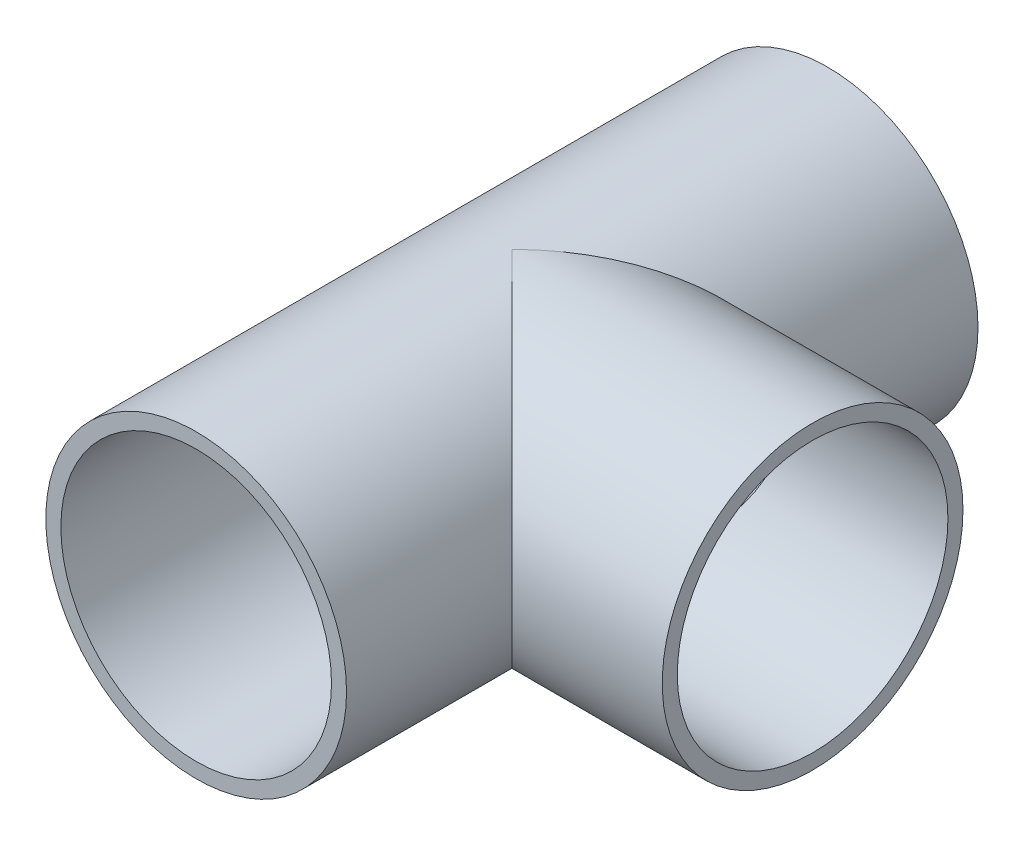
ISO-10303-21;
HEADER;
FILE_DESCRIPTION(('STEP AP214'),'2;1');
FILE_NAME('part.step','',(''),(''),'','','');
FILE_SCHEMA(('AUTOMOTIVE_DESIGN { 1 0 10303 214 1 1 1 1 }'));
ENDSEC;
DATA;
#1=APPLICATION_CONTEXT('core data for automotive mechanical design processes');
#2=APPLICATION_PROTOCOL_DEFINITION('international standard','automotive_design',2000,#1);
#3=PRODUCT_CONTEXT('',#1,'mechanical');
#4=PRODUCT('Part','Part','',(#3));
#5=PRODUCT_RELATED_PRODUCT_CATEGORY('part','',(#4));
#6=PRODUCT_DEFINITION_FORMATION('','',#4);
#7=PRODUCT_DEFINITION_CONTEXT('part definition',#1,'design');
#8=PRODUCT_DEFINITION('design','',#6,#7);
#9=PRODUCT_DEFINITION_SHAPE('','',#8);
#10=(LENGTH_UNIT() NAMED_UNIT(*) SI_UNIT(.MILLI.,.METRE.));
#11=(NAMED_UNIT(*) PLANE_ANGLE_UNIT() SI_UNIT($,.RADIAN.));
#12=(NAMED_UNIT(*) SI_UNIT($,.STERADIAN.) SOLID_ANGLE_UNIT());
#13=UNCERTAINTY_MEASURE_WITH_UNIT(LENGTH_MEASURE(1.E-05),#10,'distance_accuracy_value','');
#14=(GEOMETRIC_REPRESENTATION_CONTEXT(3) GLOBAL_UNCERTAINTY_ASSIGNED_CONTEXT((#13)) GLOBAL_UNIT_ASSIGNED_CONTEXT((#10,
#11,#12)) REPRESENTATION_CONTEXT('',''));
#15=CARTESIAN_POINT('',(0.,0.,0.));
#16=DIRECTION('',(0.,0.,1.));
#17=DIRECTION('',(1.,0.,0.));
#18=AXIS2_PLACEMENT_3D('',#15,#16,#17);
#19=CARTESIAN_POINT('',(0.,0.,53.34));
#20=DIRECTION('',(0.,0.,-1.));
#21=DIRECTION('',(-1.,0.,0.));
#22=AXIS2_PLACEMENT_3D('',#19,#20,#21);
#23=CYLINDRICAL_SURFACE('',#22,11.43);
#24=CARTESIAN_POINT('',(0.,0.,26.67));
#25=DIRECTION('',(0.707106781186547,0.,-0.707106781186547));
#26=DIRECTION('',(0.707106781186547,0.,0.707106781186547));
#27=AXIS2_PLACEMENT_3D('',#24,#25,#26);
#28=ELLIPSE('',#27,16.1644610179245,11.43);
#29=CARTESIAN_POINT('',(0.,-11.43,26.67));
#30=VERTEX_POINT('',#29);
#31=CARTESIAN_POINT('',(0.,11.43,26.67));
#32=VERTEX_POINT('',#31);
#33=EDGE_CURVE('E11',#30,#32,#28,.F.);
#34=ORIENTED_EDGE('',*,*,#33,.F.);
#35=CARTESIAN_POINT('',(0.,0.,26.67));
#36=DIRECTION('',(0.707106781186547,0.,0.707106781186547));
#37=DIRECTION('',(0.707106781186547,0.,-0.707106781186547));
#38=AXIS2_PLACEMENT_3D('',#35,#36,#37);
#39=ELLIPSE('',#38,16.1644610179245,11.43);
#40=EDGE_CURVE('E45',#32,#30,#39,.F.);
#41=ORIENTED_EDGE('',*,*,#40,.F.);
#42=EDGE_LOOP('',(#34,#41));
#43=FACE_BOUND('',#42,.T.);
#44=CARTESIAN_POINT('',(0.,0.,53.34));
#45=DIRECTION('',(0.,0.,1.));
#46=DIRECTION('',(1.,0.,0.));
#47=AXIS2_PLACEMENT_3D('',#44,#45,#46);
#48=CIRCLE('',#47,11.43);
#49=CARTESIAN_POINT('',(11.43,0.,53.34));
#50=VERTEX_POINT('',#49);
#51=EDGE_CURVE('E99',#50,#50,#48,.T.);
#52=ORIENTED_EDGE('',*,*,#51,.T.);
#53=EDGE_LOOP('',(#52));
#54=FACE_BOUND('',#53,.T.);
#55=CARTESIAN_POINT('',(0.,0.,0.));
#56=DIRECTION('',(0.,0.,1.));
#57=DIRECTION('',(1.,0.,0.));
#58=AXIS2_PLACEMENT_3D('',#55,#56,#57);
#59=CIRCLE('',#58,11.43);
#60=CARTESIAN_POINT('',(11.43,0.,0.));
#61=VERTEX_POINT('',#60);
#62=EDGE_CURVE('E97',#61,#61,#59,.T.);
#63=ORIENTED_EDGE('',*,*,#62,.F.);
#64=EDGE_LOOP('',(#63));
#65=FACE_BOUND('',#64,.T.);
#66=ADVANCED_FACE('F37',(#43,#54,#65),#23,.F.);
#67=CARTESIAN_POINT('',(0.,0.,53.34));
#68=DIRECTION('',(0.,0.,1.));
#69=DIRECTION('',(1.,0.,0.));
#70=AXIS2_PLACEMENT_3D('',#67,#68,#69);
#71=PLANE('',#70);
#72=CARTESIAN_POINT('',(0.,0.,53.34));
#73=DIRECTION('',(0.,0.,1.));
#74=DIRECTION('',(1.,0.,0.));
#75=AXIS2_PLACEMENT_3D('',#72,#73,#74);
#76=CIRCLE('',#75,12.7);
#77=CARTESIAN_POINT('',(12.7,0.,53.34));
#78=VERTEX_POINT('',#77);
#79=EDGE_CURVE('E63',#78,#78,#76,.T.);
#80=ORIENTED_EDGE('',*,*,#79,.T.);
#81=EDGE_LOOP('',(#80));
#82=FACE_BOUND('',#81,.T.);
#83=ORIENTED_EDGE('',*,*,#51,.F.);
#84=EDGE_LOOP('',(#83));
#85=FACE_BOUND('',#84,.T.);
#86=ADVANCED_FACE('F79',(#82,#85),#71,.T.);
#87=CARTESIAN_POINT('',(0.,0.,0.));
#88=DIRECTION('',(0.,0.,1.));
#89=DIRECTION('',(1.,0.,0.));
#90=AXIS2_PLACEMENT_3D('',#87,#88,#89);
#91=PLANE('',#90);
#92=CARTESIAN_POINT('',(0.,0.,0.));
#93=DIRECTION('',(0.,0.,1.));
#94=DIRECTION('',(1.,0.,0.));
#95=AXIS2_PLACEMENT_3D('',#92,#93,#94);
#96=CIRCLE('',#95,12.7);
#97=CARTESIAN_POINT('',(12.7,0.,0.));
#98=VERTEX_POINT('',#97);
#99=EDGE_CURVE('E94',#98,#98,#96,.T.);
#100=ORIENTED_EDGE('',*,*,#99,.F.);
#101=EDGE_LOOP('',(#100));
#102=FACE_BOUND('',#101,.T.);
#103=ORIENTED_EDGE('',*,*,#62,.T.);
#104=EDGE_LOOP('',(#103));
#105=FACE_BOUND('',#104,.T.);
#106=ADVANCED_FACE('F83',(#102,#105),#91,.F.);
#107=CARTESIAN_POINT('',(0.,0.,53.34));
#108=DIRECTION('',(0.,0.,-1.));
#109=DIRECTION('',(-1.,0.,0.));
#110=AXIS2_PLACEMENT_3D('',#107,#108,#109);
#111=CYLINDRICAL_SURFACE('',#110,12.7);
#112=CARTESIAN_POINT('',(0.,0.,26.67));
#113=DIRECTION('',(0.707106781186547,0.,-0.707106781186547));
#114=DIRECTION('',(-0.707106781186547,0.,-0.707106781186547));
#115=AXIS2_PLACEMENT_3D('',#112,#113,#114);
#116=ELLIPSE('',#115,17.9605122421383,12.7);
#117=CARTESIAN_POINT('',(0.,-12.7,26.67));
#118=VERTEX_POINT('',#117);
#119=CARTESIAN_POINT('',(0.,12.7,26.67));
#120=VERTEX_POINT('',#119);
#121=EDGE_CURVE('E100',#118,#120,#116,.F.);
#122=ORIENTED_EDGE('',*,*,#121,.T.);
#123=CARTESIAN_POINT('',(0.,0.,26.67));
#124=DIRECTION('',(-0.707106781186547,0.,-0.707106781186547));
#125=DIRECTION('',(0.707106781186547,0.,-0.707106781186547));
#126=AXIS2_PLACEMENT_3D('',#123,#124,#125);
#127=ELLIPSE('',#126,17.9605122421383,12.7);
#128=EDGE_CURVE('E56',#120,#118,#127,.T.);
#129=ORIENTED_EDGE('',*,*,#128,.T.);
#130=EDGE_LOOP('',(#122,#129));
#131=FACE_BOUND('',#130,.T.);
#132=ORIENTED_EDGE('',*,*,#79,.F.);
#133=EDGE_LOOP('',(#132));
#134=FACE_BOUND('',#133,.T.);
#135=ORIENTED_EDGE('',*,*,#99,.T.);
#136=EDGE_LOOP('',(#135));
#137=FACE_BOUND('',#136,.T.);
#138=ADVANCED_FACE('F39',(#131,#134,#137),#111,.T.);
#139=CARTESIAN_POINT('',(0.,0.,26.67));
#140=DIRECTION('',(1.,0.,0.));
#141=DIRECTION('',(0.,0.,-1.));
#142=AXIS2_PLACEMENT_3D('',#139,#140,#141);
#143=CYLINDRICAL_SURFACE('',#142,12.7);
#144=ORIENTED_EDGE('',*,*,#121,.F.);
#145=ORIENTED_EDGE('',*,*,#128,.F.);
#146=EDGE_LOOP('',(#144,#145));
#147=FACE_BOUND('',#146,.T.);
#148=CARTESIAN_POINT('',(25.4,0.,26.67));
#149=DIRECTION('',(1.,0.,0.));
#150=DIRECTION('',(0.,0.,-1.));
#151=AXIS2_PLACEMENT_3D('',#148,#149,#150);
#152=CIRCLE('',#151,12.7);
#153=CARTESIAN_POINT('',(25.4,0.,13.97));
#154=VERTEX_POINT('',#153);
#155=EDGE_CURVE('E115',#154,#154,#152,.T.);
#156=ORIENTED_EDGE('',*,*,#155,.F.);
#157=EDGE_LOOP('',(#156));
#158=FACE_BOUND('',#157,.T.);
#159=ADVANCED_FACE('F72',(#147,#158),#143,.T.);
#160=CARTESIAN_POINT('',(25.4,0.,26.67));
#161=DIRECTION('',(1.,0.,0.));
#162=DIRECTION('',(0.,0.,-1.));
#163=AXIS2_PLACEMENT_3D('',#160,#161,#162);
#164=PLANE('',#163);
#165=ORIENTED_EDGE('',*,*,#155,.T.);
#166=EDGE_LOOP('',(#165));
#167=FACE_BOUND('',#166,.T.);
#168=CARTESIAN_POINT('',(25.4,0.,26.67));
#169=DIRECTION('',(1.,0.,0.));
#170=DIRECTION('',(0.,0.,-1.));
#171=AXIS2_PLACEMENT_3D('',#168,#169,#170);
#172=CIRCLE('',#171,11.4300000000005);
#173=CARTESIAN_POINT('',(25.4,0.,15.2399999999995));
#174=VERTEX_POINT('',#173);
#175=EDGE_CURVE('E118',#174,#174,#172,.T.);
#176=ORIENTED_EDGE('',*,*,#175,.F.);
#177=EDGE_LOOP('',(#176));
#178=FACE_BOUND('',#177,.T.);
#179=ADVANCED_FACE('F66',(#167,#178),#164,.T.);
#180=CARTESIAN_POINT('',(0.,0.,26.67));
#181=DIRECTION('',(1.,0.,0.));
#182=DIRECTION('',(0.,0.,-1.));
#183=AXIS2_PLACEMENT_3D('',#180,#181,#182);
#184=CYLINDRICAL_SURFACE('',#183,11.43);
#185=ORIENTED_EDGE('',*,*,#175,.T.);
#186=EDGE_LOOP('',(#185));
#187=FACE_BOUND('',#186,.T.);
#188=ORIENTED_EDGE('',*,*,#40,.T.);
#189=ORIENTED_EDGE('',*,*,#33,.T.);
#190=EDGE_LOOP('',(#188,#189));
#191=FACE_BOUND('',#190,.T.);
#192=ADVANCED_FACE('F64',(#187,#191),#184,.F.);
#193=CLOSED_SHELL('',(#66,#86,#106,#138,#159,#179,#192));
#194=MANIFOLD_SOLID_BREP('B2',#193);
#195=ADVANCED_BREP_SHAPE_REPRESENTATION('',(#18,#194),#14);
#196=SHAPE_DEFINITION_REPRESENTATION(#9,#195);
ENDSEC;
END-ISO-10303-21;
